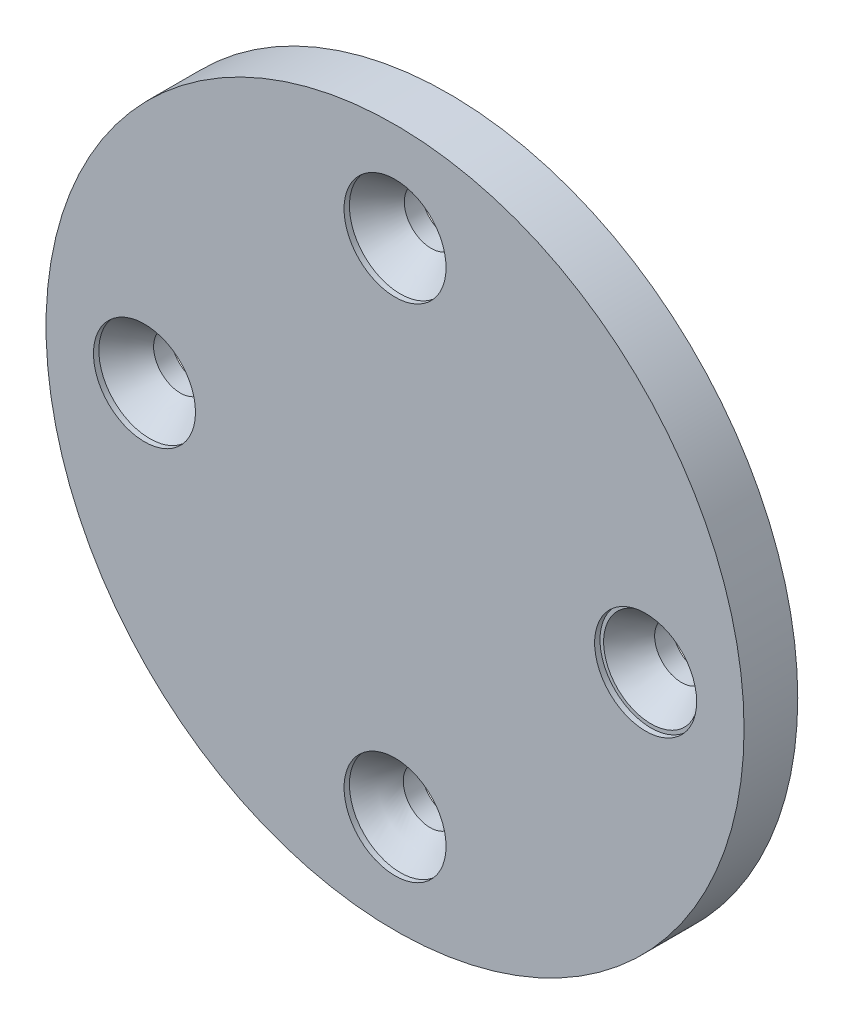
ISO-10303-21;
HEADER;
FILE_DESCRIPTION(('STEP AP214'),'2;1');
FILE_NAME('part.step','',(''),(''),'','','');
FILE_SCHEMA(('AUTOMOTIVE_DESIGN { 1 0 10303 214 1 1 1 1 }'));
ENDSEC;
DATA;
#1=APPLICATION_CONTEXT('core data for automotive mechanical design processes');
#2=APPLICATION_PROTOCOL_DEFINITION('international standard','automotive_design',2000,#1);
#3=PRODUCT_CONTEXT('',#1,'mechanical');
#4=PRODUCT('Part','Part','',(#3));
#5=PRODUCT_RELATED_PRODUCT_CATEGORY('part','',(#4));
#6=PRODUCT_DEFINITION_FORMATION('','',#4);
#7=PRODUCT_DEFINITION_CONTEXT('part definition',#1,'design');
#8=PRODUCT_DEFINITION('design','',#6,#7);
#9=PRODUCT_DEFINITION_SHAPE('','',#8);
#10=(LENGTH_UNIT() NAMED_UNIT(*) SI_UNIT(.MILLI.,.METRE.));
#11=(NAMED_UNIT(*) PLANE_ANGLE_UNIT() SI_UNIT($,.RADIAN.));
#12=(NAMED_UNIT(*) SI_UNIT($,.STERADIAN.) SOLID_ANGLE_UNIT());
#13=UNCERTAINTY_MEASURE_WITH_UNIT(LENGTH_MEASURE(1.E-05),#10,'distance_accuracy_value','');
#14=(GEOMETRIC_REPRESENTATION_CONTEXT(3) GLOBAL_UNCERTAINTY_ASSIGNED_CONTEXT((#13)) GLOBAL_UNIT_ASSIGNED_CONTEXT((#10,
#11,#12)) REPRESENTATION_CONTEXT('',''));
#15=CARTESIAN_POINT('',(0.,0.,0.));
#16=DIRECTION('',(0.,0.,1.));
#17=DIRECTION('',(1.,0.,0.));
#18=AXIS2_PLACEMENT_3D('',#15,#16,#17);
#19=CARTESIAN_POINT('',(0.,0.,3.));
#20=DIRECTION('',(0.,0.,-1.));
#21=DIRECTION('',(-1.,0.,0.));
#22=AXIS2_PLACEMENT_3D('',#19,#20,#21);
#23=CYLINDRICAL_SURFACE('',#22,19.5);
#24=CARTESIAN_POINT('',(0.,0.,3.));
#25=DIRECTION('',(0.,0.,1.));
#26=DIRECTION('',(1.,0.,0.));
#27=AXIS2_PLACEMENT_3D('',#24,#25,#26);
#28=CIRCLE('',#27,19.5);
#29=CARTESIAN_POINT('',(19.5,0.,3.));
#30=VERTEX_POINT('',#29);
#31=EDGE_CURVE('E11',#30,#30,#28,.T.);
#32=ORIENTED_EDGE('',*,*,#31,.F.);
#33=EDGE_LOOP('',(#32));
#34=FACE_BOUND('',#33,.T.);
#35=CARTESIAN_POINT('',(0.,0.,0.));
#36=DIRECTION('',(0.,0.,1.));
#37=DIRECTION('',(1.,0.,0.));
#38=AXIS2_PLACEMENT_3D('',#35,#36,#37);
#39=CIRCLE('',#38,19.5);
#40=CARTESIAN_POINT('',(19.5,0.,0.));
#41=VERTEX_POINT('',#40);
#42=EDGE_CURVE('E49',#41,#41,#39,.T.);
#43=ORIENTED_EDGE('',*,*,#42,.T.);
#44=EDGE_LOOP('',(#43));
#45=FACE_BOUND('',#44,.T.);
#46=ADVANCED_FACE('F42',(#34,#45),#23,.T.);
#47=CARTESIAN_POINT('',(0.,0.,3.));
#48=DIRECTION('',(0.,0.,1.));
#49=DIRECTION('',(1.,0.,0.));
#50=AXIS2_PLACEMENT_3D('',#47,#48,#49);
#51=PLANE('',#50);
#52=CARTESIAN_POINT('',(0.,14.,3.));
#53=DIRECTION('',(0.,0.,1.));
#54=DIRECTION('',(1.,0.,0.));
#55=AXIS2_PLACEMENT_3D('',#52,#53,#54);
#56=CIRCLE('',#55,2.85);
#57=CARTESIAN_POINT('',(2.85,14.,3.));
#58=VERTEX_POINT('',#57);
#59=EDGE_CURVE('E54',#58,#58,#56,.T.);
#60=ORIENTED_EDGE('',*,*,#59,.F.);
#61=EDGE_LOOP('',(#60));
#62=FACE_BOUND('',#61,.T.);
#63=CARTESIAN_POINT('',(14.,0.,3.));
#64=DIRECTION('',(0.,0.,1.));
#65=DIRECTION('',(1.,0.,0.));
#66=AXIS2_PLACEMENT_3D('',#63,#64,#65);
#67=CIRCLE('',#66,2.85);
#68=CARTESIAN_POINT('',(16.85,0.,3.));
#69=VERTEX_POINT('',#68);
#70=EDGE_CURVE('E138',#69,#69,#67,.T.);
#71=ORIENTED_EDGE('',*,*,#70,.F.);
#72=EDGE_LOOP('',(#71));
#73=FACE_BOUND('',#72,.T.);
#74=CARTESIAN_POINT('',(-14.,0.,3.));
#75=DIRECTION('',(0.,0.,1.));
#76=DIRECTION('',(1.,0.,0.));
#77=AXIS2_PLACEMENT_3D('',#74,#75,#76);
#78=CIRCLE('',#77,2.85);
#79=CARTESIAN_POINT('',(-11.15,0.,3.));
#80=VERTEX_POINT('',#79);
#81=EDGE_CURVE('E143',#80,#80,#78,.T.);
#82=ORIENTED_EDGE('',*,*,#81,.F.);
#83=EDGE_LOOP('',(#82));
#84=FACE_BOUND('',#83,.T.);
#85=CARTESIAN_POINT('',(0.,-14.,3.));
#86=DIRECTION('',(0.,0.,1.));
#87=DIRECTION('',(1.,0.,0.));
#88=AXIS2_PLACEMENT_3D('',#85,#86,#87);
#89=CIRCLE('',#88,2.85);
#90=CARTESIAN_POINT('',(2.85,-14.,3.));
#91=VERTEX_POINT('',#90);
#92=EDGE_CURVE('E57',#91,#91,#89,.T.);
#93=ORIENTED_EDGE('',*,*,#92,.F.);
#94=EDGE_LOOP('',(#93));
#95=FACE_BOUND('',#94,.T.);
#96=ORIENTED_EDGE('',*,*,#31,.T.);
#97=EDGE_LOOP('',(#96));
#98=FACE_BOUND('',#97,.T.);
#99=ADVANCED_FACE('F151',(#62,#73,#84,#95,#98),#51,.T.);
#100=CARTESIAN_POINT('',(0.,0.,0.));
#101=DIRECTION('',(0.,0.,1.));
#102=DIRECTION('',(1.,0.,0.));
#103=AXIS2_PLACEMENT_3D('',#100,#101,#102);
#104=PLANE('',#103);
#105=CARTESIAN_POINT('',(-14.,0.,0.));
#106=DIRECTION('',(0.,0.,1.));
#107=DIRECTION('',(1.,0.,0.));
#108=AXIS2_PLACEMENT_3D('',#105,#106,#107);
#109=CIRCLE('',#108,1.5);
#110=CARTESIAN_POINT('',(-12.5,0.,0.));
#111=VERTEX_POINT('',#110);
#112=EDGE_CURVE('E364',#111,#111,#109,.T.);
#113=ORIENTED_EDGE('',*,*,#112,.T.);
#114=EDGE_LOOP('',(#113));
#115=FACE_BOUND('',#114,.T.);
#116=CARTESIAN_POINT('',(0.,14.,0.));
#117=DIRECTION('',(0.,0.,1.));
#118=DIRECTION('',(1.,0.,0.));
#119=AXIS2_PLACEMENT_3D('',#116,#117,#118);
#120=CIRCLE('',#119,1.5);
#121=CARTESIAN_POINT('',(1.5,14.,0.));
#122=VERTEX_POINT('',#121);
#123=EDGE_CURVE('E378',#122,#122,#120,.T.);
#124=ORIENTED_EDGE('',*,*,#123,.T.);
#125=EDGE_LOOP('',(#124));
#126=FACE_BOUND('',#125,.T.);
#127=CARTESIAN_POINT('',(14.,0.,0.));
#128=DIRECTION('',(0.,0.,1.));
#129=DIRECTION('',(1.,0.,0.));
#130=AXIS2_PLACEMENT_3D('',#127,#128,#129);
#131=CIRCLE('',#130,1.5);
#132=CARTESIAN_POINT('',(15.5,0.,0.));
#133=VERTEX_POINT('',#132);
#134=EDGE_CURVE('E382',#133,#133,#131,.T.);
#135=ORIENTED_EDGE('',*,*,#134,.T.);
#136=EDGE_LOOP('',(#135));
#137=FACE_BOUND('',#136,.T.);
#138=CARTESIAN_POINT('',(0.,-14.,0.));
#139=DIRECTION('',(0.,0.,1.));
#140=DIRECTION('',(1.,0.,0.));
#141=AXIS2_PLACEMENT_3D('',#138,#139,#140);
#142=CIRCLE('',#141,1.5);
#143=CARTESIAN_POINT('',(1.5,-14.,0.));
#144=VERTEX_POINT('',#143);
#145=EDGE_CURVE('E386',#144,#144,#142,.T.);
#146=ORIENTED_EDGE('',*,*,#145,.T.);
#147=EDGE_LOOP('',(#146));
#148=FACE_BOUND('',#147,.T.);
#149=ORIENTED_EDGE('',*,*,#42,.F.);
#150=EDGE_LOOP('',(#149));
#151=FACE_BOUND('',#150,.T.);
#152=ADVANCED_FACE('F153',(#115,#126,#137,#148,#151),#104,.F.);
#153=CARTESIAN_POINT('',(0.,-14.,2.7));
#154=DIRECTION('',(0.,0.,1.));
#155=DIRECTION('',(1.,0.,0.));
#156=AXIS2_PLACEMENT_3D('',#153,#154,#155);
#157=CYLINDRICAL_SURFACE('',#156,2.85);
#158=CARTESIAN_POINT('',(0.,-14.,2.7));
#159=DIRECTION('',(0.,0.,1.));
#160=DIRECTION('',(1.,0.,0.));
#161=AXIS2_PLACEMENT_3D('',#158,#159,#160);
#162=CIRCLE('',#161,2.85);
#163=CARTESIAN_POINT('',(1.71119764217877,-11.7208987233118,2.7));
#164=VERTEX_POINT('',#163);
#165=EDGE_CURVE('E116',#164,#164,#162,.T.);
#166=ORIENTED_EDGE('',*,*,#165,.F.);
#167=EDGE_LOOP('',(#166));
#168=FACE_BOUND('',#167,.T.);
#169=ORIENTED_EDGE('',*,*,#92,.T.);
#170=EDGE_LOOP('',(#169));
#171=FACE_BOUND('',#170,.T.);
#172=ADVANCED_FACE('F98',(#168,#171),#157,.F.);
#173=CARTESIAN_POINT('',(-14.,0.,2.7));
#174=DIRECTION('',(0.,0.,1.));
#175=DIRECTION('',(1.,0.,0.));
#176=AXIS2_PLACEMENT_3D('',#173,#174,#175);
#177=CYLINDRICAL_SURFACE('',#176,2.85);
#178=CARTESIAN_POINT('',(-14.,0.,2.7));
#179=DIRECTION('',(0.,0.,1.));
#180=DIRECTION('',(1.,0.,0.));
#181=AXIS2_PLACEMENT_3D('',#178,#179,#180);
#182=CIRCLE('',#181,2.85);
#183=CARTESIAN_POINT('',(-12.1233339364085,2.14490663800644,2.7));
#184=VERTEX_POINT('',#183);
#185=EDGE_CURVE('E107',#184,#184,#182,.T.);
#186=ORIENTED_EDGE('',*,*,#185,.F.);
#187=EDGE_LOOP('',(#186));
#188=FACE_BOUND('',#187,.T.);
#189=ORIENTED_EDGE('',*,*,#81,.T.);
#190=EDGE_LOOP('',(#189));
#191=FACE_BOUND('',#190,.T.);
#192=ADVANCED_FACE('F90',(#188,#191),#177,.F.);
#193=CARTESIAN_POINT('',(14.,0.,2.7));
#194=DIRECTION('',(0.,0.,1.));
#195=DIRECTION('',(1.,0.,0.));
#196=AXIS2_PLACEMENT_3D('',#193,#194,#195);
#197=CYLINDRICAL_SURFACE('',#196,2.85);
#198=CARTESIAN_POINT('',(14.,0.,2.7));
#199=DIRECTION('',(0.,0.,1.));
#200=DIRECTION('',(1.,0.,0.));
#201=AXIS2_PLACEMENT_3D('',#198,#199,#200);
#202=CIRCLE('',#201,2.85);
#203=CARTESIAN_POINT('',(16.85,0.,2.7));
#204=VERTEX_POINT('',#203);
#205=EDGE_CURVE('E141',#204,#204,#202,.T.);
#206=ORIENTED_EDGE('',*,*,#205,.F.);
#207=EDGE_LOOP('',(#206));
#208=FACE_BOUND('',#207,.T.);
#209=ORIENTED_EDGE('',*,*,#70,.T.);
#210=EDGE_LOOP('',(#209));
#211=FACE_BOUND('',#210,.T.);
#212=ADVANCED_FACE('F87',(#208,#211),#197,.F.);
#213=CARTESIAN_POINT('',(14.,0.,2.7));
#214=DIRECTION('',(0.,0.,1.));
#215=DIRECTION('',(1.,0.,0.));
#216=AXIS2_PLACEMENT_3D('',#213,#214,#215);
#217=PLANE('',#216);
#218=CARTESIAN_POINT('',(14.,0.,2.7));
#219=DIRECTION('',(0.,0.,1.));
#220=DIRECTION('',(1.,0.,0.));
#221=AXIS2_PLACEMENT_3D('',#218,#219,#220);
#222=CIRCLE('',#221,2.64788732394366);
#223=CARTESIAN_POINT('',(16.6478873239437,0.,2.7));
#224=VERTEX_POINT('',#223);
#225=EDGE_CURVE('E355',#224,#224,#222,.T.);
#226=ORIENTED_EDGE('',*,*,#225,.F.);
#227=EDGE_LOOP('',(#226));
#228=FACE_BOUND('',#227,.T.);
#229=ORIENTED_EDGE('',*,*,#205,.T.);
#230=EDGE_LOOP('',(#229));
#231=FACE_BOUND('',#230,.T.);
#232=ADVANCED_FACE('F82',(#228,#231),#217,.T.);
#233=CARTESIAN_POINT('',(0.,14.,2.7));
#234=DIRECTION('',(0.,0.,1.));
#235=DIRECTION('',(1.,0.,0.));
#236=AXIS2_PLACEMENT_3D('',#233,#234,#235);
#237=CYLINDRICAL_SURFACE('',#236,2.85);
#238=CARTESIAN_POINT('',(0.,14.,2.7));
#239=DIRECTION('',(0.,0.,1.));
#240=DIRECTION('',(1.,0.,0.));
#241=AXIS2_PLACEMENT_3D('',#238,#239,#240);
#242=CIRCLE('',#241,2.85);
#243=CARTESIAN_POINT('',(1.26667558020564,16.5530438645881,2.7));
#244=VERTEX_POINT('',#243);
#245=EDGE_CURVE('E64',#244,#244,#242,.T.);
#246=ORIENTED_EDGE('',*,*,#245,.F.);
#247=EDGE_LOOP('',(#246));
#248=FACE_BOUND('',#247,.T.);
#249=ORIENTED_EDGE('',*,*,#59,.T.);
#250=EDGE_LOOP('',(#249));
#251=FACE_BOUND('',#250,.T.);
#252=ADVANCED_FACE('F71',(#248,#251),#237,.F.);
#253=CARTESIAN_POINT('',(1.26667558020564,16.5530438645881,2.7));
#254=CARTESIAN_POINT('',(0.889566790660115,15.1004071632603,0.87));
#255=CARTESIAN_POINT('',(6.37276330938175,14.0196927041768,2.7));
#256=CARTESIAN_POINT('',(3.09038111718079,13.3212735819401,0.87));
#257=CARTESIAN_POINT('',(3.83941214897047,8.91360497500067,2.7));
#258=CARTESIAN_POINT('',(1.31124753586056,11.1204592554194,0.87));
#259=CARTESIAN_POINT('',(-1.26667558020564,11.4469561354119,2.7));
#260=CARTESIAN_POINT('',(-0.889566790660115,12.8995928367397,0.87));
#261=CARTESIAN_POINT('',(-6.37276330938175,13.9803072958232,2.7));
#262=CARTESIAN_POINT('',(-3.09038111718079,14.6787264180599,0.87));
#263=CARTESIAN_POINT('',(-3.83941214897047,19.0863950249993,2.7));
#264=CARTESIAN_POINT('',(-1.31124753586056,16.8795407445806,0.87));
#265=CARTESIAN_POINT('',(1.26667558020564,16.5530438645881,2.7));
#266=CARTESIAN_POINT('',(0.889566790660115,15.1004071632603,0.87));
#267=(BOUNDED_SURFACE() B_SPLINE_SURFACE(3,1,((#253,#254),(#255,#256),(#257,#258),(#259,#260),
(#261,#262),(#263,#264),(#265,#266)),.UNSPECIFIED.,.T.,.F.,.F.) B_SPLINE_SURFACE_WITH_KNOTS((4,
3,4),(2,2),(0.,0.5,1.),(0.,1.),
.UNSPECIFIED.) GEOMETRIC_REPRESENTATION_ITEM() RATIONAL_B_SPLINE_SURFACE(((1.,1.),
(0.333333333333333,0.333333333333333),(0.333333333333333,0.333333333333333),(1.,1.),
(0.333333333333333,0.333333333333334),(0.333333333333333,0.333333333333334),(1.,1.))) REPRESENTATION_ITEM('') SURFACE());
#268=CARTESIAN_POINT('',(0.,14.,0.983153937944734));
#269=DIRECTION('',(0.,0.,-1.));
#270=DIRECTION('',(-1.,0.,0.));
#271=AXIS2_PLACEMENT_3D('',#268,#269,#270);
#272=CIRCLE('',#271,1.5);
#273=CARTESIAN_POINT('',(0.912884465288884,15.1902276895763,0.983153937944734));
#274=VERTEX_POINT('',#273);
#275=EDGE_CURVE('E45',#274,#274,#272,.T.);
#276=CARTESIAN_POINT('',(0.912884465288884,15.1902276895763,0.983153937944734));
#277=CARTESIAN_POINT('',(0.9165697894026,15.2044236913994,1.00103775109114));
#278=CARTESIAN_POINT('',(0.920255113516316,15.2186196932224,1.01892156423755));
#279=CARTESIAN_POINT('',(0.927625761743749,15.2470116968685,1.05468919053037));
#280=CARTESIAN_POINT('',(0.931311085857465,15.2612076986915,1.07257300367678));
#281=CARTESIAN_POINT('',(0.938681734084897,15.2895997023376,1.1083406299696));
#282=CARTESIAN_POINT('',(0.942367058198614,15.3037957041606,1.12622444311601));
#283=CARTESIAN_POINT('',(0.949737706426046,15.3321877078067,1.16199206940882));
#284=CARTESIAN_POINT('',(0.953423030539762,15.3463837096298,1.17987588255523));
#285=CARTESIAN_POINT('',(0.960793678767195,15.3747757132758,1.21564350884805));
#286=CARTESIAN_POINT('',(0.964479002880911,15.3889717150989,1.23352732199446));
#287=CARTESIAN_POINT('',(0.971849651108343,15.417363718745,1.26929494828728));
#288=CARTESIAN_POINT('',(0.975534975222059,15.431559720568,1.28717876143369));
#289=CARTESIAN_POINT('',(0.982905623449492,15.4599517242141,1.32294638772651));
#290=CARTESIAN_POINT('',(0.986590947563208,15.4741477260371,1.34083020087291));
#291=CARTESIAN_POINT('',(0.99396159579064,15.5025397296832,1.37659782716573));
#292=CARTESIAN_POINT('',(0.997646919904357,15.5167357315062,1.39448164031214));
#293=CARTESIAN_POINT('',(1.00501756813179,15.5451277351523,1.43024926660496));
#294=CARTESIAN_POINT('',(1.00870289224551,15.5593237369753,1.44813307975137));
#295=CARTESIAN_POINT('',(1.01607354047294,15.5877157406214,1.48390070604419));
#296=CARTESIAN_POINT('',(1.01975886458665,15.6019117424445,1.5017845191906));
#297=CARTESIAN_POINT('',(1.02712951281409,15.6303037460905,1.53755214548341));
#298=CARTESIAN_POINT('',(1.0308148369278,15.6444997479136,1.55543595862982));
#299=CARTESIAN_POINT('',(1.03818548515523,15.6728917515597,1.59120358492264));
#300=CARTESIAN_POINT('',(1.04187080926895,15.6870877533827,1.60908739806905));
#301=CARTESIAN_POINT('',(1.04924145749638,15.7154797570288,1.64485502436187));
#302=CARTESIAN_POINT('',(1.0529267816101,15.7296757588518,1.66273883750828));
#303=CARTESIAN_POINT('',(1.06029742983753,15.7580677624979,1.69850646380109));
#304=CARTESIAN_POINT('',(1.06398275395125,15.7722637643209,1.7163902769475));
#305=CARTESIAN_POINT('',(1.07135340217868,15.800655767967,1.75215790324032));
#306=CARTESIAN_POINT('',(1.0750387262924,15.81485176979,1.77004171638673));
#307=CARTESIAN_POINT('',(1.08240937451983,15.8432437734361,1.80580934267955));
#308=CARTESIAN_POINT('',(1.08609469863355,15.8574397752592,1.82369315582596));
#309=CARTESIAN_POINT('',(1.09346534686098,15.8858317789052,1.85946078211878));
#310=CARTESIAN_POINT('',(1.09715067097469,15.9000277807283,1.87734459526519));
#311=CARTESIAN_POINT('',(1.10452131920213,15.9284197843744,1.913112221558));
#312=CARTESIAN_POINT('',(1.10820664331584,15.9426157861974,1.93099603470441));
#313=CARTESIAN_POINT('',(1.11557729154327,15.9710077898435,1.96676366099723));
#314=CARTESIAN_POINT('',(1.11926261565699,15.9852037916665,1.98464747414364));
#315=CARTESIAN_POINT('',(1.12663326388442,16.0135957953126,2.02041510043646));
#316=CARTESIAN_POINT('',(1.13031858799814,16.0277917971356,2.03829891358287));
#317=CARTESIAN_POINT('',(1.13768923622557,16.0561838007817,2.07406653987568));
#318=CARTESIAN_POINT('',(1.14137456033929,16.0703798026047,2.09195035302209));
#319=CARTESIAN_POINT('',(1.14874520856672,16.0987718062508,2.12771797931491));
#320=CARTESIAN_POINT('',(1.15243053268044,16.1129678080739,2.14560179246132));
#321=CARTESIAN_POINT('',(1.15980118090787,16.1413598117199,2.18136941875414));
#322=CARTESIAN_POINT('',(1.16348650502159,16.155555813543,2.19925323190055));
#323=CARTESIAN_POINT('',(1.17085715324902,16.183947817189,2.23502085819337));
#324=CARTESIAN_POINT('',(1.17454247736273,16.1981438190121,2.25290467133977));
#325=CARTESIAN_POINT('',(1.18191312559017,16.2265358226582,2.28867229763259));
#326=CARTESIAN_POINT('',(1.18559844970388,16.2407318244812,2.306556110779));
#327=CARTESIAN_POINT('',(1.19296909793131,16.2691238281273,2.34232373707182));
#328=CARTESIAN_POINT('',(1.19665442204503,16.2833198299503,2.36020755021823));
#329=CARTESIAN_POINT('',(1.20402507027246,16.3117118335964,2.39597517651105));
#330=CARTESIAN_POINT('',(1.20771039438618,16.3259078354194,2.41385898965746));
#331=CARTESIAN_POINT('',(1.21508104261361,16.3542998390655,2.44962661595027));
#332=CARTESIAN_POINT('',(1.21876636672733,16.3684958408885,2.46751042909668));
#333=CARTESIAN_POINT('',(1.22613701495476,16.3968878445346,2.5032780553895));
#334=CARTESIAN_POINT('',(1.22982233906848,16.4110838463577,2.52116186853591));
#335=CARTESIAN_POINT('',(1.23719298729591,16.4394758500037,2.55692949482873));
#336=CARTESIAN_POINT('',(1.24087831140963,16.4536718518268,2.57481330797514));
#337=CARTESIAN_POINT('',(1.24824895963706,16.4820638554729,2.61058093426796));
#338=CARTESIAN_POINT('',(1.25193428375077,16.4962598572959,2.62846474741436));
#339=CARTESIAN_POINT('',(1.25930493197821,16.524651860942,2.66423237370718));
#340=CARTESIAN_POINT('',(1.26299025609192,16.538847862765,2.68211618685359));
#341=CARTESIAN_POINT('',(1.26667558020564,16.5530438645881,2.7));
#342=B_SPLINE_CURVE_WITH_KNOTS('',3,(#276,#277,#278,#279,#280,#281,#282,#283,#284,#285,#286,
#287,#288,#289,#290,#291,#292,#293,#294,#295,#296,#297,#298,#299,#300,#301,#302,#303,#304,#305,
#306,#307,#308,#309,#310,#311,#312,#313,#314,#315,#316,#317,#318,#319,#320,#321,#322,#323,#324,
#325,#326,#327,#328,#329,#330,#331,#332,#333,#334,#335,#336,#337,#338,#339,#340,#341),
.UNSPECIFIED.,.F.,.F.,(4,2,2,2,2,2,2,2,2,2,2,2,2,2,2,2,2,2,2,2,2,2,2,2,2,2,2,2,2,2,2,2,4),(0.,
0.0693862355813235,0.138772471162646,0.208158706743968,0.277544942325289,0.346931177906611,
0.416317413487935,0.485703649069257,0.555089884650579,0.624476120231901,0.693862355813223,
0.763248591394546,0.832634826975868,0.902021062557191,0.971407298138512,1.04079353371984,
1.11017976930116,1.17956600488248,1.2489522404638,1.31833847604513,1.38772471162645,
1.45711094720777,1.52649718278909,1.59588341837041,1.66526965395174,1.73465588953306,
1.80404212511438,1.8734283606957,1.94281459627702,2.01220083185835,2.08158706743967,
2.15097330302099,2.22035953860231),.UNSPECIFIED.);
#343=EDGE_CURVE('BSEAM81',#274,#244,#342,.T.);
#344=ORIENTED_EDGE('',*,*,#275,.T.);
#345=ORIENTED_EDGE('',*,*,#245,.T.);
#346=ORIENTED_EDGE('',*,*,#343,.T.);
#347=ORIENTED_EDGE('',*,*,#343,.F.);
#348=EDGE_LOOP('',(#344,#346,#345,#347));
#349=FACE_BOUND('',#348,.T.);
#350=ADVANCED_FACE('F81',(#349),#267,.F.);
#351=CARTESIAN_POINT('',(-12.1233339364085,2.14490663800644,2.7));
#352=CARTESIAN_POINT('',(-13.4757988583615,1.31432041873543,0.87));
#353=CARTESIAN_POINT('',(-7.83352066039564,-1.6084254891765,2.7));
#354=CARTESIAN_POINT('',(-10.8471580208906,0.265918135458375,0.87));
#355=CARTESIAN_POINT('',(-11.5868527875786,-5.89823876518938,2.7));
#356=CARTESIAN_POINT('',(-11.8955603041677,-2.36272270201248,0.87));
#357=CARTESIAN_POINT('',(-15.8766660635915,-2.14490663800644,2.7));
#358=CARTESIAN_POINT('',(-14.5242011416385,-1.31432041873543,0.87));
#359=CARTESIAN_POINT('',(-20.1664793396044,1.6084254891765,2.7));
#360=CARTESIAN_POINT('',(-17.1528419791094,-0.265918135458374,0.87));
#361=CARTESIAN_POINT('',(-16.4131472124214,5.89823876518938,2.7));
#362=CARTESIAN_POINT('',(-16.1044396958323,2.36272270201248,0.87));
#363=CARTESIAN_POINT('',(-12.1233339364085,2.14490663800644,2.7));
#364=CARTESIAN_POINT('',(-13.4757988583615,1.31432041873543,0.87));
#365=(BOUNDED_SURFACE() B_SPLINE_SURFACE(3,1,((#351,#352),(#353,#354),(#355,#356),(#357,#358),
(#359,#360),(#361,#362),(#363,#364)),.UNSPECIFIED.,.T.,.F.,.F.) B_SPLINE_SURFACE_WITH_KNOTS((4,
3,4),(2,2),(0.,0.5,1.),(0.,1.),
.UNSPECIFIED.) GEOMETRIC_REPRESENTATION_ITEM() RATIONAL_B_SPLINE_SURFACE(((1.,1.),
(0.333333333333333,0.333333333333333),(0.333333333333333,0.333333333333333),(1.,1.),
(0.333333333333333,0.333333333333333),(0.333333333333333,0.333333333333333),(1.,1.))) REPRESENTATION_ITEM('') SURFACE());
#366=CARTESIAN_POINT('',(-14.,0.,0.990370669794886));
#367=DIRECTION('',(0.,0.,-1.));
#368=DIRECTION('',(-1.,0.,0.));
#369=AXIS2_PLACEMENT_3D('',#366,#367,#368);
#370=CIRCLE('',#369,1.5);
#371=CARTESIAN_POINT('',(-13.3868386897661,1.36895332558573,0.990370669794886));
#372=VERTEX_POINT('',#371);
#373=EDGE_CURVE('E366',#372,#372,#370,.T.);
#374=CARTESIAN_POINT('',(-13.3868386897661,1.36895332558573,0.990370669794886));
#375=CARTESIAN_POINT('',(-13.3736771819186,1.37703617259011,1.00817930865119));
#376=CARTESIAN_POINT('',(-13.3605156740711,1.38511901959449,1.02598794750749));
#377=CARTESIAN_POINT('',(-13.3341926583762,1.40128471360326,1.0616052252201));
#378=CARTESIAN_POINT('',(-13.3210311505287,1.40936756060764,1.0794138640764));
#379=CARTESIAN_POINT('',(-13.2947081348338,1.42553325461641,1.11503114178901));
#380=CARTESIAN_POINT('',(-13.2815466269863,1.43361610162079,1.13283978064531));
#381=CARTESIAN_POINT('',(-13.2552236112913,1.44978179562955,1.16845705835792));
#382=CARTESIAN_POINT('',(-13.2420621034439,1.45786464263394,1.18626569721422));
#383=CARTESIAN_POINT('',(-13.2157390877489,1.4740303366427,1.22188297492683));
#384=CARTESIAN_POINT('',(-13.2025775799014,1.48211318364708,1.23969161378313));
#385=CARTESIAN_POINT('',(-13.1762545642065,1.49827887765585,1.27530889149574));
#386=CARTESIAN_POINT('',(-13.163093056359,1.50636172466023,1.29311753035204));
#387=CARTESIAN_POINT('',(-13.1367700406641,1.52252741866899,1.32873480806465));
#388=CARTESIAN_POINT('',(-13.1236085328166,1.53061026567338,1.34654344692095));
#389=CARTESIAN_POINT('',(-13.0972855171216,1.54677595968214,1.38216072463356));
#390=CARTESIAN_POINT('',(-13.0841240092742,1.55485880668652,1.39996936348986));
#391=CARTESIAN_POINT('',(-13.0578009935792,1.57102450069529,1.43558664120247));
#392=CARTESIAN_POINT('',(-13.0446394857317,1.57910734769967,1.45339528005877));
#393=CARTESIAN_POINT('',(-13.0183164700368,1.59527304170844,1.48901255777138));
#394=CARTESIAN_POINT('',(-13.0051549621893,1.60335588871282,1.50682119662768));
#395=CARTESIAN_POINT('',(-12.9788319464944,1.61952158272158,1.54243847434029));
#396=CARTESIAN_POINT('',(-12.9656704386469,1.62760442972597,1.56024711319659));
#397=CARTESIAN_POINT('',(-12.939347422952,1.64377012373473,1.5958643909092));
#398=CARTESIAN_POINT('',(-12.9261859151045,1.65185297073911,1.6136730297655));
#399=CARTESIAN_POINT('',(-12.8998628994095,1.66801866474788,1.64929030747811));
#400=CARTESIAN_POINT('',(-12.8867013915621,1.67610151175226,1.66709894633441));
#401=CARTESIAN_POINT('',(-12.8603783758671,1.69226720576103,1.70271622404702));
#402=CARTESIAN_POINT('',(-12.8472168680196,1.70035005276541,1.72052486290332));
#403=CARTESIAN_POINT('',(-12.8208938523247,1.71651574677417,1.75614214061593));
#404=CARTESIAN_POINT('',(-12.8077323444772,1.72459859377856,1.77395077947223));
#405=CARTESIAN_POINT('',(-12.7814093287823,1.74076428778732,1.80956805718484));
#406=CARTESIAN_POINT('',(-12.7682478209348,1.7488471347917,1.82737669604114));
#407=CARTESIAN_POINT('',(-12.7419248052398,1.76501282880047,1.86299397375375));
#408=CARTESIAN_POINT('',(-12.7287632973924,1.77309567580485,1.88080261261005));
#409=CARTESIAN_POINT('',(-12.7024402816974,1.78926136981362,1.91641989032266));
#410=CARTESIAN_POINT('',(-12.6892787738499,1.797344216818,1.93422852917896));
#411=CARTESIAN_POINT('',(-12.662955758155,1.81350991082676,1.96984580689157));
#412=CARTESIAN_POINT('',(-12.6497942503075,1.82159275783115,1.98765444574787));
#413=CARTESIAN_POINT('',(-12.6234712346126,1.83775845183991,2.02327172346048));
#414=CARTESIAN_POINT('',(-12.6103097267651,1.84584129884429,2.04108036231678));
#415=CARTESIAN_POINT('',(-12.5839867110701,1.86200699285306,2.07669764002939));
#416=CARTESIAN_POINT('',(-12.5708252032227,1.87008983985744,2.09450627888569));
#417=CARTESIAN_POINT('',(-12.5445021875277,1.8862555338662,2.1301235565983));
#418=CARTESIAN_POINT('',(-12.5313406796802,1.89433838087059,2.1479321954546));
#419=CARTESIAN_POINT('',(-12.5050176639853,1.91050407487935,2.18354947316721));
#420=CARTESIAN_POINT('',(-12.4918561561378,1.91858692188373,2.20135811202351));
#421=CARTESIAN_POINT('',(-12.4655331404429,1.9347526158925,2.23697538973612));
#422=CARTESIAN_POINT('',(-12.4523716325954,1.94283546289688,2.25478402859242));
#423=CARTESIAN_POINT('',(-12.4260486169004,1.95900115690565,2.29040130630503));
#424=CARTESIAN_POINT('',(-12.412887109053,1.96708400391003,2.30820994516133));
#425=CARTESIAN_POINT('',(-12.386564093358,1.98324969791879,2.34382722287393));
#426=CARTESIAN_POINT('',(-12.3734025855105,1.99133254492318,2.36163586173024));
#427=CARTESIAN_POINT('',(-12.3470795698156,2.00749823893194,2.39725313944284));
#428=CARTESIAN_POINT('',(-12.3339180619681,2.01558108593632,2.41506177829915));
#429=CARTESIAN_POINT('',(-12.3075950462732,2.03174677994509,2.45067905601175));
#430=CARTESIAN_POINT('',(-12.2944335384257,2.03982962694947,2.46848769486806));
#431=CARTESIAN_POINT('',(-12.2681105227307,2.05599532095824,2.50410497258066));
#432=CARTESIAN_POINT('',(-12.2549490148833,2.06407816796262,2.52191361143697));
#433=CARTESIAN_POINT('',(-12.2286259991883,2.08024386197138,2.55753088914957));
#434=CARTESIAN_POINT('',(-12.2154644913409,2.08832670897577,2.57533952800588));
#435=CARTESIAN_POINT('',(-12.1891414756459,2.10449240298453,2.61095680571848));
#436=CARTESIAN_POINT('',(-12.1759799677984,2.11257524998891,2.62876544457479));
#437=CARTESIAN_POINT('',(-12.1496569521035,2.12874094399768,2.66438272228739));
#438=CARTESIAN_POINT('',(-12.136495444256,2.13682379100206,2.6821913611437));
#439=CARTESIAN_POINT('',(-12.1233339364085,2.14490663800644,2.7));
#440=B_SPLINE_CURVE_WITH_KNOTS('',3,(#374,#375,#376,#377,#378,#379,#380,#381,#382,#383,#384,
#385,#386,#387,#388,#389,#390,#391,#392,#393,#394,#395,#396,#397,#398,#399,#400,#401,#402,#403,
#404,#405,#406,#407,#408,#409,#410,#411,#412,#413,#414,#415,#416,#417,#418,#419,#420,#421,#422,
#423,#424,#425,#426,#427,#428,#429,#430,#431,#432,#433,#434,#435,#436,#437,#438,#439),
.UNSPECIFIED.,.F.,.F.,(4,2,2,2,2,2,2,2,2,2,2,2,2,2,2,2,2,2,2,2,2,2,2,2,2,2,2,2,2,2,2,2,4),(0.,
0.0707202085818944,0.141440417163788,0.212160625745682,0.282880834327576,0.35360104290947,
0.424321251491364,0.495041460073257,0.565761668655153,0.636481877237046,0.707202085818941,
0.777922294400835,0.848642502982729,0.919362711564623,0.990082920146516,1.06080312872841,
1.1315233373103,1.2022435458922,1.27296375447409,1.34368396305599,1.41440417163788,
1.48512438021978,1.55584458880167,1.62656479738356,1.69728500596546,1.76800521454735,
1.83872542312924,1.90944563171114,1.98016584029303,2.05088604887493,2.12160625745682,
2.19232646603872,2.26304667462061),.UNSPECIFIED.);
#441=EDGE_CURVE('BSEAM231',#372,#184,#440,.T.);
#442=ORIENTED_EDGE('',*,*,#373,.T.);
#443=ORIENTED_EDGE('',*,*,#185,.T.);
#444=ORIENTED_EDGE('',*,*,#441,.T.);
#445=ORIENTED_EDGE('',*,*,#441,.F.);
#446=EDGE_LOOP('',(#442,#444,#443,#445));
#447=FACE_BOUND('',#446,.T.);
#448=ADVANCED_FACE('F231',(#447),#365,.F.);
#449=CARTESIAN_POINT('',(1.71119764217877,-11.7208987233118,2.7));
#450=CARTESIAN_POINT('',(1.36853334426872,-13.6403592269713,0.87));
#451=CARTESIAN_POINT('',(6.26940019555519,-15.1432940076693,2.7));
#452=CARTESIAN_POINT('',(2.08781489032611,-16.3774259155087,0.87));
#453=CARTESIAN_POINT('',(2.84700491119765,-19.7014965610457,2.7));
#454=CARTESIAN_POINT('',(-0.649251798211331,-17.0967074615661,0.87));
#455=CARTESIAN_POINT('',(-1.71119764217877,-16.2791012766882,2.7));
#456=CARTESIAN_POINT('',(-1.36853334426872,-14.3596407730287,0.87));
#457=CARTESIAN_POINT('',(-6.26940019555519,-12.8567059923307,2.7));
#458=CARTESIAN_POINT('',(-2.08781489032611,-11.6225740844913,0.87));
#459=CARTESIAN_POINT('',(-2.84700491119765,-8.29850343895425,2.7));
#460=CARTESIAN_POINT('',(0.64925179821133,-10.9032925384339,0.87));
#461=CARTESIAN_POINT('',(1.71119764217877,-11.7208987233118,2.7));
#462=CARTESIAN_POINT('',(1.36853334426872,-13.6403592269713,0.87));
#463=(BOUNDED_SURFACE() B_SPLINE_SURFACE(3,1,((#449,#450),(#451,#452),(#453,#454),(#455,#456),
(#457,#458),(#459,#460),(#461,#462)),.UNSPECIFIED.,.T.,.F.,.F.) B_SPLINE_SURFACE_WITH_KNOTS((4,
3,4),(2,2),(0.,0.5,1.),(0.,1.),
.UNSPECIFIED.) GEOMETRIC_REPRESENTATION_ITEM() RATIONAL_B_SPLINE_SURFACE(((1.,1.),
(0.333333333333333,0.333333333333333),(0.333333333333333,0.333333333333333),(1.,1.),
(0.333333333333333,0.333333333333333),(0.333333333333333,0.333333333333333),(1.,1.))) REPRESENTATION_ITEM('') SURFACE());
#464=CARTESIAN_POINT('',(0.,-14.,1.03974871902218));
#465=DIRECTION('',(0.,0.,-1.));
#466=DIRECTION('',(-1.,0.,0.));
#467=AXIS2_PLACEMENT_3D('',#464,#465,#466);
#468=CIRCLE('',#467,1.5);
#469=CARTESIAN_POINT('',(1.4003184948834,-13.4623122533594,1.03974871902218));
#470=VERTEX_POINT('',#469);
#471=EDGE_CURVE('E363',#470,#470,#468,.T.);
#472=CARTESIAN_POINT('',(1.4003184948834,-13.4623122533594,1.03974871902218));
#473=CARTESIAN_POINT('',(1.40355681933439,-13.444172529088,1.05704300319903));
#474=CARTESIAN_POINT('',(1.40679514378539,-13.4260328048167,1.07433728737588));
#475=CARTESIAN_POINT('',(1.41327179268737,-13.389753356274,1.10892585572959));
#476=CARTESIAN_POINT('',(1.41651011713837,-13.3716136320027,1.12622013990644));
#477=CARTESIAN_POINT('',(1.42298676604035,-13.3353341834601,1.16080870826014));
#478=CARTESIAN_POINT('',(1.42622509049135,-13.3171944591887,1.17810299243699));
#479=CARTESIAN_POINT('',(1.43270173939333,-13.2809150106461,1.2126915607907));
#480=CARTESIAN_POINT('',(1.43594006384433,-13.2627752863747,1.22998584496755));
#481=CARTESIAN_POINT('',(1.44241671274631,-13.2264958378321,1.26457441332126));
#482=CARTESIAN_POINT('',(1.44565503719731,-13.2083561135608,1.28186869749811));
#483=CARTESIAN_POINT('',(1.45213168609929,-13.1720766650181,1.31645726585181));
#484=CARTESIAN_POINT('',(1.45537001055029,-13.1539369407468,1.33375155002867));
#485=CARTESIAN_POINT('',(1.46184665945227,-13.1176574922041,1.36834011838237));
#486=CARTESIAN_POINT('',(1.46508498390327,-13.0995177679328,1.38563440255922));
#487=CARTESIAN_POINT('',(1.47156163280525,-13.0632383193901,1.42022297091293));
#488=CARTESIAN_POINT('',(1.47479995725625,-13.0450985951188,1.43751725508978));
#489=CARTESIAN_POINT('',(1.48127660615823,-13.0088191465761,1.47210582344348));
#490=CARTESIAN_POINT('',(1.48451493060923,-12.9906794223048,1.48940010762034));
#491=CARTESIAN_POINT('',(1.49099157951122,-12.9543999737622,1.52398867597404));
#492=CARTESIAN_POINT('',(1.49422990396221,-12.9362602494908,1.54128296015089));
#493=CARTESIAN_POINT('',(1.5007065528642,-12.8999808009482,1.5758715285046));
#494=CARTESIAN_POINT('',(1.50394487731519,-12.8818410766768,1.59316581268145));
#495=CARTESIAN_POINT('',(1.51042152621718,-12.8455616281342,1.62775438103516));
#496=CARTESIAN_POINT('',(1.51365985066817,-12.8274219038628,1.64504866521201));
#497=CARTESIAN_POINT('',(1.52013649957016,-12.7911424553202,1.67963723356571));
#498=CARTESIAN_POINT('',(1.52337482402115,-12.7730027310489,1.69693151774256));
#499=CARTESIAN_POINT('',(1.52985147292314,-12.7367232825062,1.73152008609627));
#500=CARTESIAN_POINT('',(1.53308979737413,-12.7185835582349,1.74881437027312));
#501=CARTESIAN_POINT('',(1.53956644627612,-12.6823041096922,1.78340293862683));
#502=CARTESIAN_POINT('',(1.54280477072711,-12.6641643854209,1.80069722280368));
#503=CARTESIAN_POINT('',(1.5492814196291,-12.6278849368782,1.83528579115738));
#504=CARTESIAN_POINT('',(1.55251974408009,-12.6097452126069,1.85258007533424));
#505=CARTESIAN_POINT('',(1.55899639298208,-12.5734657640642,1.88716864368794));
#506=CARTESIAN_POINT('',(1.56223471743307,-12.5553260397929,1.90446292786479));
#507=CARTESIAN_POINT('',(1.56871136633506,-12.5190465912503,1.9390514962185));
#508=CARTESIAN_POINT('',(1.57194969078605,-12.5009068669789,1.95634578039535));
#509=CARTESIAN_POINT('',(1.57842633968804,-12.4646274184363,1.99093434874905));
#510=CARTESIAN_POINT('',(1.58166466413903,-12.4464876941649,2.00822863292591));
#511=CARTESIAN_POINT('',(1.58814131304102,-12.4102082456223,2.04281720127961));
#512=CARTESIAN_POINT('',(1.59137963749201,-12.392068521351,2.06011148545646));
#513=CARTESIAN_POINT('',(1.597856286394,-12.3557890728083,2.09470005381017));
#514=CARTESIAN_POINT('',(1.60109461084499,-12.337649348537,2.11199433798702));
#515=CARTESIAN_POINT('',(1.60757125974698,-12.3013698999943,2.14658290634073));
#516=CARTESIAN_POINT('',(1.61080958419797,-12.283230175723,2.16387719051758));
#517=CARTESIAN_POINT('',(1.61728623309996,-12.2469507271803,2.19846575887128));
#518=CARTESIAN_POINT('',(1.62052455755095,-12.228811002909,2.21576004304814));
#519=CARTESIAN_POINT('',(1.62700120645294,-12.1925315543663,2.25034861140184));
#520=CARTESIAN_POINT('',(1.63023953090393,-12.174391830095,2.26764289557869));
#521=CARTESIAN_POINT('',(1.63671617980592,-12.1381123815524,2.3022314639324));
#522=CARTESIAN_POINT('',(1.63995450425691,-12.119972657281,2.31952574810925));
#523=CARTESIAN_POINT('',(1.6464311531589,-12.0836932087384,2.35411431646295));
#524=CARTESIAN_POINT('',(1.64966947760989,-12.065553484467,2.37140860063981));
#525=CARTESIAN_POINT('',(1.65614612651188,-12.0292740359244,2.40599716899351));
#526=CARTESIAN_POINT('',(1.65938445096287,-12.0111343116531,2.42329145317036));
#527=CARTESIAN_POINT('',(1.66586109986486,-11.9748548631104,2.45788002152407));
#528=CARTESIAN_POINT('',(1.66909942431585,-11.9567151388391,2.47517430570092));
#529=CARTESIAN_POINT('',(1.67557607321784,-11.9204356902964,2.50976287405462));
#530=CARTESIAN_POINT('',(1.67881439766884,-11.9022959660251,2.52705715823148));
#531=CARTESIAN_POINT('',(1.68529104657082,-11.8660165174824,2.56164572658518));
#532=CARTESIAN_POINT('',(1.68852937102182,-11.8478767932111,2.57894001076203));
#533=CARTESIAN_POINT('',(1.6950060199238,-11.8115973446684,2.61352857911574));
#534=CARTESIAN_POINT('',(1.6982443443748,-11.7934576203971,2.63082286329259));
#535=CARTESIAN_POINT('',(1.70472099327678,-11.7571781718544,2.6654114316463));
#536=CARTESIAN_POINT('',(1.70795931772778,-11.7390384475831,2.68270571582315));
#537=CARTESIAN_POINT('',(1.71119764217877,-11.7208987233118,2.7));
#538=B_SPLINE_CURVE_WITH_KNOTS('',3,(#472,#473,#474,#475,#476,#477,#478,#479,#480,#481,#482,
#483,#484,#485,#486,#487,#488,#489,#490,#491,#492,#493,#494,#495,#496,#497,#498,#499,#500,#501,
#502,#503,#504,#505,#506,#507,#508,#509,#510,#511,#512,#513,#514,#515,#516,#517,#518,#519,#520,
#521,#522,#523,#524,#525,#526,#527,#528,#529,#530,#531,#532,#533,#534,#535,#536,#537),
.UNSPECIFIED.,.F.,.F.,(4,2,2,2,2,2,2,2,2,2,2,2,2,2,2,2,2,2,2,2,2,2,2,2,2,2,2,2,2,2,2,2,4),(0.,
0.0758133066401605,0.151626613280321,0.227439919920485,0.303253226560645,0.379066533200807,
0.454879839840968,0.53069314648113,0.606506453121291,0.682319759761454,0.758133066401615,
0.833946373041776,0.909759679681939,0.9855729863221,1.06138629296226,1.13719959960242,
1.21301290624258,1.28882621288275,1.36463951952291,1.44045282616307,1.51626613280323,
1.59207943944339,1.66789274608355,1.74370605272372,1.81951935936388,1.89533266600404,
1.9711459726442,2.04695927928436,2.12277258592452,2.19858589256468,2.27439919920485,
2.35021250584501,2.42602581248517),.UNSPECIFIED.);
#539=EDGE_CURVE('BSEAM241',#470,#164,#538,.T.);
#540=ORIENTED_EDGE('',*,*,#471,.T.);
#541=ORIENTED_EDGE('',*,*,#165,.T.);
#542=ORIENTED_EDGE('',*,*,#539,.T.);
#543=ORIENTED_EDGE('',*,*,#539,.F.);
#544=EDGE_LOOP('',(#540,#542,#541,#543));
#545=FACE_BOUND('',#544,.T.);
#546=ADVANCED_FACE('F241',(#545),#463,.F.);
#547=CARTESIAN_POINT('',(14.,0.,0.87));
#548=DIRECTION('',(0.,0.,1.));
#549=DIRECTION('',(1.,0.,0.));
#550=AXIS2_PLACEMENT_3D('',#547,#548,#549);
#551=CONICAL_SURFACE('',#550,1.415,0.592862176524641);
#552=CARTESIAN_POINT('',(14.,0.,0.996167247386759));
#553=DIRECTION('',(0.,0.,1.));
#554=DIRECTION('',(1.,0.,0.));
#555=AXIS2_PLACEMENT_3D('',#552,#553,#554);
#556=CIRCLE('',#555,1.5);
#557=CARTESIAN_POINT('',(15.5,0.,0.996167247386759));
#558=VERTEX_POINT('',#557);
#559=EDGE_CURVE('E360',#558,#558,#556,.F.);
#560=ORIENTED_EDGE('',*,*,#559,.T.);
#561=EDGE_LOOP('',(#560));
#562=FACE_BOUND('',#561,.T.);
#563=ORIENTED_EDGE('',*,*,#225,.T.);
#564=EDGE_LOOP('',(#563));
#565=FACE_BOUND('',#564,.T.);
#566=ADVANCED_FACE('F251',(#562,#565),#551,.F.);
#567=CARTESIAN_POINT('',(14.,0.,0.));
#568=DIRECTION('',(0.,0.,1.));
#569=DIRECTION('',(1.,0.,0.));
#570=AXIS2_PLACEMENT_3D('',#567,#568,#569);
#571=CYLINDRICAL_SURFACE('',#570,1.5);
#572=ORIENTED_EDGE('',*,*,#134,.F.);
#573=EDGE_LOOP('',(#572));
#574=FACE_BOUND('',#573,.T.);
#575=ORIENTED_EDGE('',*,*,#559,.F.);
#576=EDGE_LOOP('',(#575));
#577=FACE_BOUND('',#576,.T.);
#578=ADVANCED_FACE('F262',(#574,#577),#571,.F.);
#579=CARTESIAN_POINT('',(0.,-14.,0.));
#580=DIRECTION('',(0.,0.,1.));
#581=DIRECTION('',(1.,0.,0.));
#582=AXIS2_PLACEMENT_3D('',#579,#580,#581);
#583=CYLINDRICAL_SURFACE('',#582,1.5);
#584=ORIENTED_EDGE('',*,*,#145,.F.);
#585=EDGE_LOOP('',(#584));
#586=FACE_BOUND('',#585,.T.);
#587=ORIENTED_EDGE('',*,*,#471,.F.);
#588=EDGE_LOOP('',(#587));
#589=FACE_BOUND('',#588,.T.);
#590=ADVANCED_FACE('F273',(#586,#589),#583,.F.);
#591=CARTESIAN_POINT('',(-14.,0.,0.));
#592=DIRECTION('',(0.,0.,1.));
#593=DIRECTION('',(1.,0.,0.));
#594=AXIS2_PLACEMENT_3D('',#591,#592,#593);
#595=CYLINDRICAL_SURFACE('',#594,1.5);
#596=ORIENTED_EDGE('',*,*,#112,.F.);
#597=EDGE_LOOP('',(#596));
#598=FACE_BOUND('',#597,.T.);
#599=ORIENTED_EDGE('',*,*,#373,.F.);
#600=EDGE_LOOP('',(#599));
#601=FACE_BOUND('',#600,.T.);
#602=ADVANCED_FACE('F284',(#598,#601),#595,.F.);
#603=CARTESIAN_POINT('',(0.,14.,0.));
#604=DIRECTION('',(0.,0.,1.));
#605=DIRECTION('',(1.,0.,0.));
#606=AXIS2_PLACEMENT_3D('',#603,#604,#605);
#607=CYLINDRICAL_SURFACE('',#606,1.5);
#608=ORIENTED_EDGE('',*,*,#123,.F.);
#609=EDGE_LOOP('',(#608));
#610=FACE_BOUND('',#609,.T.);
#611=ORIENTED_EDGE('',*,*,#275,.F.);
#612=EDGE_LOOP('',(#611));
#613=FACE_BOUND('',#612,.T.);
#614=ADVANCED_FACE('F295',(#610,#613),#607,.F.);
#615=CLOSED_SHELL('',(#46,#99,#152,#172,#192,#212,#232,#252,#350,#448,#546,#566,#578,#590,#602,#614));
#616=MANIFOLD_SOLID_BREP('B2',#615);
#617=ADVANCED_BREP_SHAPE_REPRESENTATION('',(#18,#616),#14);
#618=SHAPE_DEFINITION_REPRESENTATION(#9,#617);
ENDSEC;
END-ISO-10303-21;
